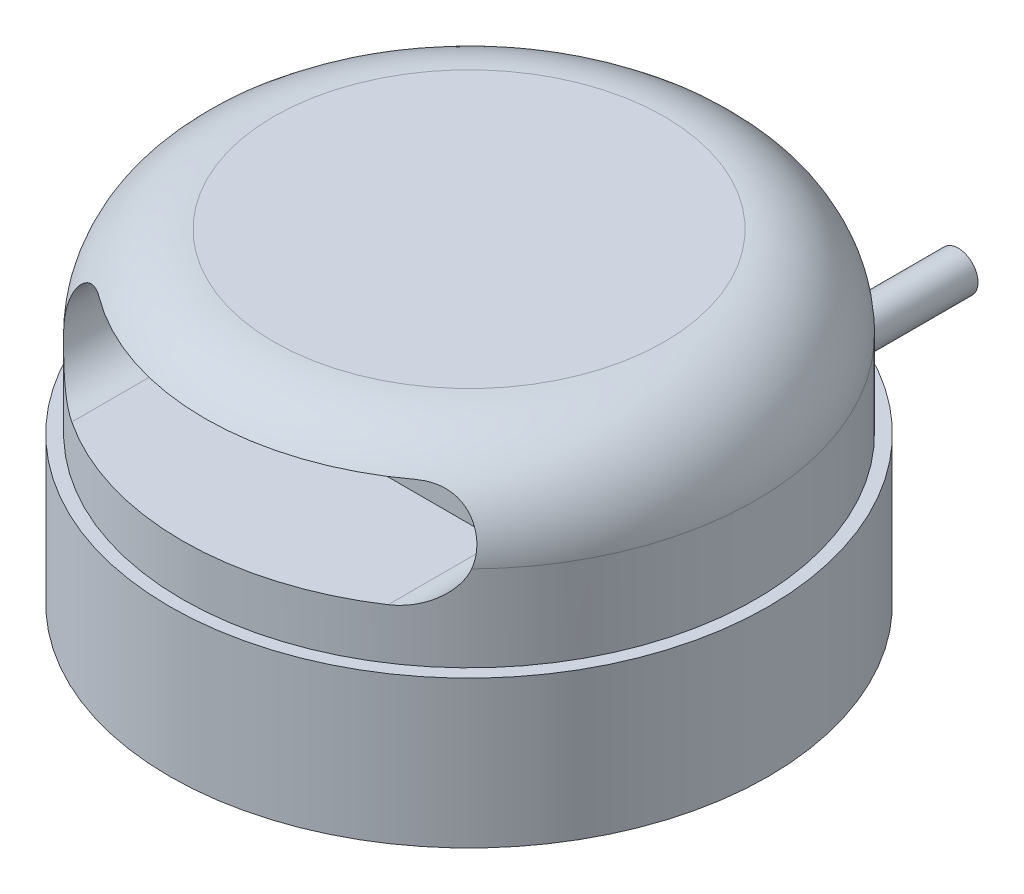
ISO-10303-21;
HEADER;
FILE_DESCRIPTION(('STEP AP214'),'2;1');
FILE_NAME('part.step','',(''),(''),'','','');
FILE_SCHEMA(('AUTOMOTIVE_DESIGN { 1 0 10303 214 1 1 1 1 }'));
ENDSEC;
DATA;
#1=APPLICATION_CONTEXT('core data for automotive mechanical design processes');
#2=APPLICATION_PROTOCOL_DEFINITION('international standard','automotive_design',2000,#1);
#3=PRODUCT_CONTEXT('',#1,'mechanical');
#4=PRODUCT('Part','Part','',(#3));
#5=PRODUCT_RELATED_PRODUCT_CATEGORY('part','',(#4));
#6=PRODUCT_DEFINITION_FORMATION('','',#4);
#7=PRODUCT_DEFINITION_CONTEXT('part definition',#1,'design');
#8=PRODUCT_DEFINITION('design','',#6,#7);
#9=PRODUCT_DEFINITION_SHAPE('','',#8);
#10=(LENGTH_UNIT() NAMED_UNIT(*) SI_UNIT(.MILLI.,.METRE.));
#11=(NAMED_UNIT(*) PLANE_ANGLE_UNIT() SI_UNIT($,.RADIAN.));
#12=(NAMED_UNIT(*) SI_UNIT($,.STERADIAN.) SOLID_ANGLE_UNIT());
#13=UNCERTAINTY_MEASURE_WITH_UNIT(LENGTH_MEASURE(1.E-05),#10,'distance_accuracy_value','');
#14=(GEOMETRIC_REPRESENTATION_CONTEXT(3) GLOBAL_UNCERTAINTY_ASSIGNED_CONTEXT((#13)) GLOBAL_UNIT_ASSIGNED_CONTEXT((#10,
#11,#12)) REPRESENTATION_CONTEXT('',''));
#15=CARTESIAN_POINT('',(0.,0.,0.));
#16=DIRECTION('',(0.,0.,1.));
#17=DIRECTION('',(1.,0.,0.));
#18=AXIS2_PLACEMENT_3D('',#15,#16,#17);
#19=CARTESIAN_POINT('',(0.,18.6,0.));
#20=DIRECTION('',(0.,-1.,0.));
#21=DIRECTION('',(0.,0.,-1.));
#22=AXIS2_PLACEMENT_3D('',#19,#20,#21);
#23=CYLINDRICAL_SURFACE('',#22,37.85);
#24=CARTESIAN_POINT('',(0.,9.5,0.));
#25=DIRECTION('',(0.,-1.,0.));
#26=DIRECTION('',(0.,0.,-1.));
#27=AXIS2_PLACEMENT_3D('',#24,#25,#26);
#28=CIRCLE('',#27,37.85);
#29=CARTESIAN_POINT('',(1.5,9.5,-37.8202657314832));
#30=VERTEX_POINT('',#29);
#31=CARTESIAN_POINT('',(-1.5,9.5,-37.8202657314832));
#32=VERTEX_POINT('',#31);
#33=EDGE_CURVE('E123',#30,#32,#28,.F.);
#34=ORIENTED_EDGE('',*,*,#33,.T.);
#35=CARTESIAN_POINT('',(-1.5,9.5,-37.8202657314832));
#36=CARTESIAN_POINT('',(-1.61253668712296,9.50001105184399,-37.8158072600323));
#37=CARTESIAN_POINT('',(-1.72504665527195,9.49525089813898,-37.8108371188779));
#38=CARTESIAN_POINT('',(-1.94921183622977,9.47628443016993,-37.7999413756868));
#39=CARTESIAN_POINT('',(-2.06086712013102,9.46207891039861,-37.7940158540432));
#40=CARTESIAN_POINT('',(-2.28243367643271,9.42433618036682,-37.7812826127025));
#41=CARTESIAN_POINT('',(-2.39234653027072,9.40080800337446,-37.7744757512726));
#42=CARTESIAN_POINT('',(-2.60972904452675,9.34462248128555,-37.7600808433361));
#43=CARTESIAN_POINT('',(-2.71719871197811,9.31196516247318,-37.7524927990785));
#44=CARTESIAN_POINT('',(-3.03487494604378,9.20059514186978,-37.7287281353576));
#45=CARTESIAN_POINT('',(-3.24048215674725,9.10846149616332,-37.7115431539878));
#46=CARTESIAN_POINT('',(-3.63313529085081,8.89118762776028,-37.6757461154074));
#47=CARTESIAN_POINT('',(-3.82018270805348,8.76605006438571,-37.6571341732612));
#48=CARTESIAN_POINT('',(-4.1715431118037,8.48556365663615,-37.6198365365566));
#49=CARTESIAN_POINT('',(-4.33574616134677,8.33007682497635,-37.6011509022075));
#50=CARTESIAN_POINT('',(-4.63574689453859,7.99357518161206,-37.5653463713142));
#51=CARTESIAN_POINT('',(-4.77154080247248,7.81255698200863,-37.5482276831946));
#52=CARTESIAN_POINT('',(-5.01082197457301,7.43003127987546,-37.5170464354348));
#53=CARTESIAN_POINT('',(-5.11430718674005,7.22852247701746,-37.5029840699259));
#54=CARTESIAN_POINT('',(-5.28588852054455,6.81073787635938,-37.4791866731115));
#55=CARTESIAN_POINT('',(-5.35398867830439,6.59446376591857,-37.4694511482921));
#56=CARTESIAN_POINT('',(-5.45233093677881,6.15521553429311,-37.4552674440067));
#57=CARTESIAN_POINT('',(-5.48288615280145,5.93231292895144,-37.4507755499511));
#58=CARTESIAN_POINT('',(-5.50624836080323,5.48449604860082,-37.4473480764364));
#59=CARTESIAN_POINT('',(-5.49905634996064,5.25958182688996,-37.4484123501985));
#60=CARTESIAN_POINT('',(-5.44732982033783,4.8157835419917,-37.4559709002314));
#61=CARTESIAN_POINT('',(-5.40305593074246,4.59686837494064,-37.4624272773163));
#62=CARTESIAN_POINT('',(-5.27883197336075,4.16961461620023,-37.4801325326619));
#63=CARTESIAN_POINT('',(-5.19888136506025,3.9612761848052,-37.4913814835316));
#64=CARTESIAN_POINT('',(-5.00530542424873,3.56026246940452,-37.5177151099787));
#65=CARTESIAN_POINT('',(-4.89156481519368,3.3676437290046,-37.5328128906292));
#66=CARTESIAN_POINT('',(-4.6337479161764,3.00414994913723,-37.565512106906));
#67=CARTESIAN_POINT('',(-4.48967128216891,2.83327515630633,-37.5831135709262));
#68=CARTESIAN_POINT('',(-4.17375936046013,2.51645421965203,-37.619512521416));
#69=CARTESIAN_POINT('',(-4.00167991617439,2.37075296909975,-37.6383195552361));
#70=CARTESIAN_POINT('',(-3.63531007884672,2.11017319004632,-37.6754665912568));
#71=CARTESIAN_POINT('',(-3.44101232933224,1.99530491271445,-37.6938064362994));
#72=CARTESIAN_POINT('',(-3.13683554275677,1.84848133332179,-37.7199320966155));
#73=CARTESIAN_POINT('',(-3.0330199695629,1.80369933992932,-37.7284313027375));
#74=CARTESIAN_POINT('',(-2.82194030576844,1.7230683043069,-37.7448052794968));
#75=CARTESIAN_POINT('',(-2.7146775361779,1.68721588516698,-37.7526802854182));
#76=CARTESIAN_POINT('',(-2.49758205344854,1.62474746649678,-37.7676636625462));
#77=CARTESIAN_POINT('',(-2.38775229982334,1.59812134118843,-37.7747728682667));
#78=CARTESIAN_POINT('',(-2.16622513815565,1.5542577371177,-37.7881233805168));
#79=CARTESIAN_POINT('',(-2.05452867352173,1.53701565536417,-37.7943651114329));
#80=CARTESIAN_POINT('',(-1.86883704656302,1.51635523480229,-37.8039067195663));
#81=CARTESIAN_POINT('',(-1.79514709109818,1.5102190922482,-37.8074780076315));
#82=CARTESIAN_POINT('',(-1.64764354230537,1.50204427809651,-37.8141934406102));
#83=CARTESIAN_POINT('',(-1.57383035562941,1.4999988398539,-37.8173382828814));
#84=CARTESIAN_POINT('',(-1.5,1.5,-37.8202657314832));
#85=B_SPLINE_CURVE_WITH_KNOTS('',3,(#35,#36,#37,#38,#39,#40,#41,#42,#43,#44,#45,#46,#47,#48,#49,
#50,#51,#52,#53,#54,#55,#56,#57,#58,#59,#60,#61,#62,#63,#64,#65,#66,#67,#68,#69,#70,#71,#72,#73,
#74,#75,#76,#77,#78,#79,#80,#81,#82,#83,#84),.UNSPECIFIED.,.F.,.F.,(4,2,2,2,2,2,2,2,2,2,2,2,2,2,
2,2,2,2,2,2,2,2,2,2,4),(0.,0.33776203725115,0.675495667393629,1.01290284479916,1.35030905076774,
2.02471981770825,2.69907625995383,3.3765733493742,4.05416042437273,4.73179052573439,
5.40934331765596,6.08120627582832,6.75305148531195,7.42021388864467,8.08738640005289,
8.75686167094439,9.42634453486127,10.1020125545614,10.7779049390013,11.1177155457961,
11.4573974501353,11.7967053669086,12.1358466985442,12.3578338425291,12.579453481404),.UNSPECIFIED.);
#86=CARTESIAN_POINT('',(-1.5,1.5,-37.8202657314832));
#87=VERTEX_POINT('',#86);
#88=EDGE_CURVE('E133',#32,#87,#85,.T.);
#89=ORIENTED_EDGE('',*,*,#88,.T.);
#90=CARTESIAN_POINT('',(0.,1.5,0.));
#91=DIRECTION('',(0.,1.,0.));
#92=DIRECTION('',(0.,0.,1.));
#93=AXIS2_PLACEMENT_3D('',#90,#91,#92);
#94=CIRCLE('',#93,37.85);
#95=CARTESIAN_POINT('',(1.5,1.5,-37.8202657314832));
#96=VERTEX_POINT('',#95);
#97=EDGE_CURVE('E139',#87,#96,#94,.F.);
#98=ORIENTED_EDGE('',*,*,#97,.T.);
#99=CARTESIAN_POINT('',(1.5,1.5,-37.8202657314832));
#100=CARTESIAN_POINT('',(1.61253668712296,1.49998894815601,-37.8158072600323));
#101=CARTESIAN_POINT('',(1.72504665527195,1.50474910186102,-37.8108371188779));
#102=CARTESIAN_POINT('',(1.94921183622977,1.52371556983007,-37.7999413756868));
#103=CARTESIAN_POINT('',(2.06086712013103,1.53792108960139,-37.7940158540432));
#104=CARTESIAN_POINT('',(2.28243367643271,1.57566381963319,-37.7812826127025));
#105=CARTESIAN_POINT('',(2.39234653027072,1.59919199662554,-37.7744757512726));
#106=CARTESIAN_POINT('',(2.60972904452675,1.65537751871445,-37.7600808433361));
#107=CARTESIAN_POINT('',(2.71719871197812,1.68803483752682,-37.7524927990785));
#108=CARTESIAN_POINT('',(3.03487494604378,1.79940485813022,-37.7287281353576));
#109=CARTESIAN_POINT('',(3.24048215674725,1.89153850383668,-37.7115431539878));
#110=CARTESIAN_POINT('',(3.63313529085081,2.10881237223972,-37.6757461154074));
#111=CARTESIAN_POINT('',(3.82018270805348,2.23394993561429,-37.6571341732612));
#112=CARTESIAN_POINT('',(4.1715431118037,2.51443634336386,-37.6198365365566));
#113=CARTESIAN_POINT('',(4.33574616134678,2.66992317502366,-37.6011509022075));
#114=CARTESIAN_POINT('',(4.63574689453859,3.00642481838794,-37.5653463713142));
#115=CARTESIAN_POINT('',(4.77154080247248,3.18744301799137,-37.5482276831946));
#116=CARTESIAN_POINT('',(5.01082197457301,3.56996872012454,-37.5170464354348));
#117=CARTESIAN_POINT('',(5.11430718674006,3.77147752298254,-37.5029840699259));
#118=CARTESIAN_POINT('',(5.28588852054455,4.18926212364062,-37.4791866731115));
#119=CARTESIAN_POINT('',(5.35398867830439,4.40553623408143,-37.4694511482921));
#120=CARTESIAN_POINT('',(5.45233093677881,4.84478446570689,-37.4552674440067));
#121=CARTESIAN_POINT('',(5.48288615280145,5.06768707104856,-37.4507755499511));
#122=CARTESIAN_POINT('',(5.50624836080323,5.51550395139918,-37.4473480764364));
#123=CARTESIAN_POINT('',(5.49905634996064,5.74041817311004,-37.4484123501985));
#124=CARTESIAN_POINT('',(5.44732982033783,6.1842164580083,-37.4559709002314));
#125=CARTESIAN_POINT('',(5.40305593074247,6.40313162505936,-37.4624272773163));
#126=CARTESIAN_POINT('',(5.27883197336075,6.83038538379977,-37.4801325326619));
#127=CARTESIAN_POINT('',(5.19888136506025,7.0387238151948,-37.4913814835316));
#128=CARTESIAN_POINT('',(5.00530542424874,7.43973753059548,-37.5177151099787));
#129=CARTESIAN_POINT('',(4.89156481519369,7.6323562709954,-37.5328128906292));
#130=CARTESIAN_POINT('',(4.63374791617641,7.99585005086276,-37.565512106906));
#131=CARTESIAN_POINT('',(4.48967128216891,8.16672484369367,-37.5831135709262));
#132=CARTESIAN_POINT('',(4.17375936046013,8.48354578034797,-37.619512521416));
#133=CARTESIAN_POINT('',(4.00167991617439,8.62924703090025,-37.6383195552361));
#134=CARTESIAN_POINT('',(3.63531007884672,8.88982680995368,-37.6754665912568));
#135=CARTESIAN_POINT('',(3.44101232933225,9.00469508728554,-37.6938064362994));
#136=CARTESIAN_POINT('',(3.13683554275678,9.15151866667821,-37.7199320966155));
#137=CARTESIAN_POINT('',(3.0330199695629,9.19630066007068,-37.7284313027375));
#138=CARTESIAN_POINT('',(2.82194030576844,9.27693169569311,-37.7448052794968));
#139=CARTESIAN_POINT('',(2.7146775361779,9.31278411483301,-37.7526802854182));
#140=CARTESIAN_POINT('',(2.49758205344854,9.37525253350322,-37.7676636625462));
#141=CARTESIAN_POINT('',(2.38775229982334,9.40187865881157,-37.7747728682667));
#142=CARTESIAN_POINT('',(2.16622513815566,9.44574226288231,-37.7881233805168));
#143=CARTESIAN_POINT('',(2.05452867352173,9.46298434463583,-37.7943651114329));
#144=CARTESIAN_POINT('',(1.86883704656302,9.48364476519771,-37.8039067195663));
#145=CARTESIAN_POINT('',(1.79514709109818,9.4897809077518,-37.8074780076315));
#146=CARTESIAN_POINT('',(1.64764354230537,9.49795572190349,-37.8141934406102));
#147=CARTESIAN_POINT('',(1.57383035562941,9.5000011601461,-37.8173382828814));
#148=CARTESIAN_POINT('',(1.5,9.5,-37.8202657314832));
#149=B_SPLINE_CURVE_WITH_KNOTS('',3,(#99,#100,#101,#102,#103,#104,#105,#106,#107,#108,#109,#110,
#111,#112,#113,#114,#115,#116,#117,#118,#119,#120,#121,#122,#123,#124,#125,#126,#127,#128,#129,
#130,#131,#132,#133,#134,#135,#136,#137,#138,#139,#140,#141,#142,#143,#144,#145,#146,#147,#148),
.UNSPECIFIED.,.F.,.F.,(4,2,2,2,2,2,2,2,2,2,2,2,2,2,2,2,2,2,2,2,2,2,2,2,4),(0.,0.33776203725115,
0.67549566739363,1.01290284479916,1.35030905076774,2.02471981770825,2.69907625995383,
3.37657334937419,4.05416042437273,4.73179052573439,5.40934331765596,6.08120627582831,
6.75305148531195,7.42021388864467,8.08738640005288,8.75686167094439,9.42634453486127,
10.1020125545614,10.7779049390013,11.1177155457961,11.4573974501353,11.7967053669086,
12.1358466985442,12.3578338425291,12.579453481404),.UNSPECIFIED.);
#150=EDGE_CURVE('E51',#96,#30,#149,.T.);
#151=ORIENTED_EDGE('',*,*,#150,.T.);
#152=EDGE_LOOP('',(#34,#89,#98,#151));
#153=FACE_BOUND('',#152,.T.);
#154=CARTESIAN_POINT('',(0.,18.6,0.));
#155=DIRECTION('',(0.,1.,0.));
#156=DIRECTION('',(0.,0.,1.));
#157=AXIS2_PLACEMENT_3D('',#154,#155,#156);
#158=CIRCLE('',#157,37.85);
#159=CARTESIAN_POINT('',(0.,18.6,37.85));
#160=VERTEX_POINT('',#159);
#161=EDGE_CURVE('E513',#160,#160,#158,.T.);
#162=ORIENTED_EDGE('',*,*,#161,.F.);
#163=EDGE_LOOP('',(#162));
#164=FACE_BOUND('',#163,.T.);
#165=CARTESIAN_POINT('',(0.,0.,0.));
#166=DIRECTION('',(0.,1.,0.));
#167=DIRECTION('',(0.,0.,1.));
#168=AXIS2_PLACEMENT_3D('',#165,#166,#167);
#169=CIRCLE('',#168,37.85);
#170=CARTESIAN_POINT('',(0.,0.,37.85));
#171=VERTEX_POINT('',#170);
#172=EDGE_CURVE('E522',#171,#171,#169,.T.);
#173=ORIENTED_EDGE('',*,*,#172,.T.);
#174=EDGE_LOOP('',(#173));
#175=FACE_BOUND('',#174,.T.);
#176=ADVANCED_FACE('F36',(#153,#164,#175),#23,.T.);
#177=CARTESIAN_POINT('',(0.,18.6,0.));
#178=DIRECTION('',(0.,1.,0.));
#179=DIRECTION('',(0.,0.,1.));
#180=AXIS2_PLACEMENT_3D('',#177,#178,#179);
#181=PLANE('',#180);
#182=CARTESIAN_POINT('',(0.,18.6,0.));
#183=DIRECTION('',(0.,-1.,0.));
#184=DIRECTION('',(0.,0.,-1.));
#185=AXIS2_PLACEMENT_3D('',#182,#183,#184);
#186=CIRCLE('',#185,36.25);
#187=CARTESIAN_POINT('',(0.,18.6,-36.25));
#188=VERTEX_POINT('',#187);
#189=EDGE_CURVE('E530',#188,#188,#186,.T.);
#190=ORIENTED_EDGE('',*,*,#189,.T.);
#191=EDGE_LOOP('',(#190));
#192=FACE_BOUND('',#191,.T.);
#193=ORIENTED_EDGE('',*,*,#161,.T.);
#194=EDGE_LOOP('',(#193));
#195=FACE_BOUND('',#194,.T.);
#196=ADVANCED_FACE('F267',(#192,#195),#181,.T.);
#197=CARTESIAN_POINT('',(0.,0.,0.));
#198=DIRECTION('',(0.,1.,0.));
#199=DIRECTION('',(0.,0.,1.));
#200=AXIS2_PLACEMENT_3D('',#197,#198,#199);
#201=PLANE('',#200);
#202=CARTESIAN_POINT('',(-20.8596500450031,0.,20.8596500450031));
#203=DIRECTION('',(0.,-1.,0.));
#204=DIRECTION('',(0.,0.,-1.));
#205=AXIS2_PLACEMENT_3D('',#202,#203,#204);
#206=CIRCLE('',#205,1.69999999999999);
#207=CARTESIAN_POINT('',(-20.8596500450031,0.,19.1596500450032));
#208=VERTEX_POINT('',#207);
#209=EDGE_CURVE('E129',#208,#208,#206,.T.);
#210=ORIENTED_EDGE('',*,*,#209,.F.);
#211=EDGE_LOOP('',(#210));
#212=FACE_BOUND('',#211,.T.);
#213=CARTESIAN_POINT('',(20.8596500450031,0.,20.8596500450031));
#214=DIRECTION('',(0.,-1.,0.));
#215=DIRECTION('',(0.,0.,-1.));
#216=AXIS2_PLACEMENT_3D('',#213,#214,#215);
#217=CIRCLE('',#216,1.69999999999999);
#218=CARTESIAN_POINT('',(20.8596500450031,0.,19.1596500450032));
#219=VERTEX_POINT('',#218);
#220=EDGE_CURVE('E466',#219,#219,#217,.T.);
#221=ORIENTED_EDGE('',*,*,#220,.F.);
#222=EDGE_LOOP('',(#221));
#223=FACE_BOUND('',#222,.T.);
#224=CARTESIAN_POINT('',(20.8596500450031,0.,-20.8596500450031));
#225=DIRECTION('',(0.,-1.,0.));
#226=DIRECTION('',(0.,0.,-1.));
#227=AXIS2_PLACEMENT_3D('',#224,#225,#226);
#228=CIRCLE('',#227,1.69999999999999);
#229=CARTESIAN_POINT('',(20.8596500450031,0.,-22.5596500450031));
#230=VERTEX_POINT('',#229);
#231=EDGE_CURVE('E472',#230,#230,#228,.T.);
#232=ORIENTED_EDGE('',*,*,#231,.F.);
#233=EDGE_LOOP('',(#232));
#234=FACE_BOUND('',#233,.T.);
#235=CARTESIAN_POINT('',(-20.8596500450031,0.,-20.8596500450031));
#236=DIRECTION('',(0.,-1.,0.));
#237=DIRECTION('',(0.,0.,-1.));
#238=AXIS2_PLACEMENT_3D('',#235,#236,#237);
#239=CIRCLE('',#238,1.69999999999999);
#240=CARTESIAN_POINT('',(-20.8596500450031,0.,-22.5596500450031));
#241=VERTEX_POINT('',#240);
#242=EDGE_CURVE('E478',#241,#241,#239,.T.);
#243=ORIENTED_EDGE('',*,*,#242,.F.);
#244=EDGE_LOOP('',(#243));
#245=FACE_BOUND('',#244,.T.);
#246=ORIENTED_EDGE('',*,*,#172,.F.);
#247=EDGE_LOOP('',(#246));
#248=FACE_BOUND('',#247,.T.);
#249=ADVANCED_FACE('F265',(#212,#223,#234,#245,#248),#201,.F.);
#250=CARTESIAN_POINT('',(0.,41.,0.));
#251=DIRECTION('',(0.,-1.,0.));
#252=DIRECTION('',(0.,0.,-1.));
#253=AXIS2_PLACEMENT_3D('',#250,#251,#252);
#254=PLANE('',#253);
#255=CARTESIAN_POINT('',(0.,41.,0.));
#256=DIRECTION('',(0.,-1.,0.));
#257=DIRECTION('',(0.,0.,-1.));
#258=AXIS2_PLACEMENT_3D('',#255,#256,#257);
#259=CIRCLE('',#258,24.6823382141137);
#260=CARTESIAN_POINT('',(0.,41.,-24.6823382141137));
#261=VERTEX_POINT('',#260);
#262=EDGE_CURVE('E525',#261,#261,#259,.T.);
#263=ORIENTED_EDGE('',*,*,#262,.F.);
#264=EDGE_LOOP('',(#263));
#265=FACE_BOUND('',#264,.T.);
#266=ADVANCED_FACE('F259',(#265),#254,.F.);
#267=CARTESIAN_POINT('',(0.,29.4323382141137,0.));
#268=DIRECTION('',(0.,-1.,0.));
#269=DIRECTION('',(0.,0.,-1.));
#270=AXIS2_PLACEMENT_3D('',#267,#268,#269);
#271=TOROIDAL_SURFACE('',#270,24.6823382141137,11.5676617858863);
#272=CARTESIAN_POINT('',(0.,29.4323382141137,0.));
#273=DIRECTION('',(0.,-1.,0.));
#274=DIRECTION('',(0.,0.,-1.));
#275=AXIS2_PLACEMENT_3D('',#272,#273,#274);
#276=CIRCLE('',#275,36.25);
#277=CARTESIAN_POINT('',(-25.7915832485661,29.4323382141137,25.4726664001294));
#278=VERTEX_POINT('',#277);
#279=CARTESIAN_POINT('',(25.7915832485661,29.4323382141137,25.4726664001294));
#280=VERTEX_POINT('',#279);
#281=EDGE_CURVE('E510',#278,#280,#276,.T.);
#282=ORIENTED_EDGE('',*,*,#281,.F.);
#283=CARTESIAN_POINT('',(-25.7915291089968,29.4321382141137,25.4727212149472));
#284=CARTESIAN_POINT('',(-25.834369599522,29.5903106740177,25.4293771303518));
#285=CARTESIAN_POINT('',(-25.8708047372308,29.750664240021,25.387626775763));
#286=CARTESIAN_POINT('',(-25.9304940586516,30.0746296389626,25.3073712621504));
#287=CARTESIAN_POINT('',(-25.9537462110058,30.2382419700234,25.2688666040317));
#288=CARTESIAN_POINT('',(-25.9867087429567,30.5678000780522,25.1951224701447));
#289=CARTESIAN_POINT('',(-25.9964002820002,30.7337487786058,25.159887600575));
#290=CARTESIAN_POINT('',(-26.0019382217081,31.066568595162,25.0928901572033));
#291=CARTESIAN_POINT('',(-25.9977854739844,31.2334396537966,25.0611273699452));
#292=CARTESIAN_POINT('',(-25.9754776098843,31.5671671107134,25.0012417281311));
#293=CARTESIAN_POINT('',(-25.9573012151964,31.7340231010123,24.9731244808076));
#294=CARTESIAN_POINT('',(-25.9068917587686,32.0662338463615,24.9208887890671));
#295=CARTESIAN_POINT('',(-25.8746589213471,32.2315886253257,24.8967702808452));
#296=CARTESIAN_POINT('',(-25.7962519500024,32.5594397651069,24.8529389030441));
#297=CARTESIAN_POINT('',(-25.7500872681503,32.7219379851052,24.8332230622019));
#298=CARTESIAN_POINT('',(-25.644025994902,33.0429236257679,24.7986638117663));
#299=CARTESIAN_POINT('',(-25.5841300113686,33.2014112236315,24.7838201865584));
#300=CARTESIAN_POINT('',(-25.4532665497505,33.5077194082037,24.7600053731427));
#301=CARTESIAN_POINT('',(-25.3827526873975,33.6557193605219,24.7508491393538));
#302=CARTESIAN_POINT('',(-25.2297322170818,33.9456344180614,24.7382223985196));
#303=CARTESIAN_POINT('',(-25.1472265192455,34.0875499840029,24.734751460231));
#304=CARTESIAN_POINT('',(-24.9708518609463,34.3641544336166,24.7341560975746));
#305=CARTESIAN_POINT('',(-24.8769831067072,34.4988434483767,24.7370315580447));
#306=CARTESIAN_POINT('',(-24.6787012354933,34.7598683349299,24.7498237440254));
#307=CARTESIAN_POINT('',(-24.5742888599882,34.8862047930756,24.7597399746961));
#308=CARTESIAN_POINT('',(-24.3631900631354,35.121390811717,24.7863804947781));
#309=CARTESIAN_POINT('',(-24.2571135273792,35.2308444245337,24.8026097446667));
#310=CARTESIAN_POINT('',(-24.0376669474697,35.4407538638338,24.8423004206009));
#311=CARTESIAN_POINT('',(-23.9242974508657,35.5412103644611,24.865761304202));
#312=CARTESIAN_POINT('',(-23.691563015799,35.7323363889596,24.9202778079311));
#313=CARTESIAN_POINT('',(-23.5722060978655,35.8230185189126,24.9513234728282));
#314=CARTESIAN_POINT('',(-23.3286239514553,35.9942389713798,25.0212707620515));
#315=CARTESIAN_POINT('',(-23.2043988979907,36.0747776581183,25.0601721041703));
#316=CARTESIAN_POINT('',(-22.9594364109958,36.2212021704031,25.1434922894571));
#317=CARTESIAN_POINT('',(-22.838890857461,36.2876546916277,25.1874824191737));
#318=CARTESIAN_POINT('',(-22.5956953494698,36.4111897676229,25.2824097031083));
#319=CARTESIAN_POINT('',(-22.4730446260833,36.4682688145973,25.3333494450543));
#320=CARTESIAN_POINT('',(-22.2264507865135,36.5732321236396,25.4420031173541));
#321=CARTESIAN_POINT('',(-22.1025054039623,36.6210956701409,25.4997318504873));
#322=CARTESIAN_POINT('',(-21.8545068028367,36.7077195546776,25.6214603739771));
#323=CARTESIAN_POINT('',(-21.7304535709768,36.7464785391725,25.6854610947644));
#324=CARTESIAN_POINT('',(-21.4688353682969,36.8191934144669,25.8268880044347));
#325=CARTESIAN_POINT('',(-21.3313532446537,36.85208793495,25.9050120457454));
#326=CARTESIAN_POINT('',(-21.058046987586,36.9076215231359,26.0676255750817));
#327=CARTESIAN_POINT('',(-20.9222235250306,36.9302565667483,26.1521175456821));
#328=CARTESIAN_POINT('',(-20.6536619974084,36.9658177970346,26.3261063038909));
#329=CARTESIAN_POINT('',(-20.5209108103335,36.9787982708633,26.4155720195455));
#330=CARTESIAN_POINT('',(-20.2582077625725,36.9958822830094,26.5990416357387));
#331=CARTESIAN_POINT('',(-20.12825295807,36.9999956591803,26.6930403884213));
#332=CARTESIAN_POINT('',(-19.9998,36.9999999966667,26.788956882745));
#333=B_SPLINE_CURVE_WITH_KNOTS('',3,(#283,#284,#285,#286,#287,#288,#289,#290,#291,#292,#293,
#294,#295,#296,#297,#298,#299,#300,#301,#302,#303,#304,#305,#306,#307,#308,#309,#310,#311,#312,
#313,#314,#315,#316,#317,#318,#319,#320,#321,#322,#323,#324,#325,#326,#327,#328,#329,#330,#331,
#332),.UNSPECIFIED.,.F.,.F.,(4,2,2,2,2,2,2,2,2,2,2,2,2,2,2,2,2,2,2,2,2,2,2,2,4),(0.,
0.508392767732529,1.01686385211273,1.52604068600459,2.0351861991708,2.54510577021678,
3.05501720405968,3.56458346285607,4.07412716831793,4.56607962019392,5.05799475456218,
5.54990096268321,6.04177260204706,6.50102851628354,6.9602499901342,7.41887193131846,
7.87747739989973,8.3105060762716,8.74369643568819,9.17784947883735,9.61206702508224,
10.0961064054761,10.580335477436,11.0618207314103,11.5427715123487),.UNSPECIFIED.);
#334=CARTESIAN_POINT('',(-20.,37.,26.7888075642195));
#335=VERTEX_POINT('',#334);
#336=EDGE_CURVE('E247',#278,#335,#333,.T.);
#337=ORIENTED_EDGE('',*,*,#336,.T.);
#338=CARTESIAN_POINT('',(0.,37.,0.));
#339=DIRECTION('',(0.,1.,0.));
#340=DIRECTION('',(0.,0.,1.));
#341=AXIS2_PLACEMENT_3D('',#338,#339,#340);
#342=CIRCLE('',#341,33.431126375173);
#343=CARTESIAN_POINT('',(20.,37.,26.7888075642026));
#344=VERTEX_POINT('',#343);
#345=EDGE_CURVE('E39',#335,#344,#342,.T.);
#346=ORIENTED_EDGE('',*,*,#345,.T.);
#347=CARTESIAN_POINT('',(19.9998,36.9999999966667,26.788956882745));
#348=CARTESIAN_POINT('',(20.1422745771607,36.9999927319548,26.682563430961));
#349=CARTESIAN_POINT('',(20.2866157949047,36.9949327316935,26.5785254636698));
#350=CARTESIAN_POINT('',(20.5787438959839,36.9738246308488,26.3760900933883));
#351=CARTESIAN_POINT('',(20.7265359231809,36.9577589611176,26.2777019822592));
#352=CARTESIAN_POINT('',(21.0256970806642,36.9136217532393,26.0872843462736));
#353=CARTESIAN_POINT('',(21.1770821515148,36.8854800666127,25.9952956812242));
#354=CARTESIAN_POINT('',(21.4815712611897,36.8162959550229,25.819516436352));
#355=CARTESIAN_POINT('',(21.6346741741503,36.7752615522998,25.7357208009749));
#356=CARTESIAN_POINT('',(21.9169122759622,36.6871504801021,25.5899707378738));
#357=CARTESIAN_POINT('',(22.0459765710467,36.6420805308274,25.5266641776465));
#358=CARTESIAN_POINT('',(22.3034748647654,36.541938076642,25.4070893686154));
#359=CARTESIAN_POINT('',(22.4319089744082,36.4868674034779,25.3508198340819));
#360=CARTESIAN_POINT('',(22.6866678138935,36.366711354006,25.2458550239663));
#361=CARTESIAN_POINT('',(22.8129976057756,36.3016556729363,25.1971381234166));
#362=CARTESIAN_POINT('',(23.062711836971,36.1614241100409,25.1072939944817));
#363=CARTESIAN_POINT('',(23.1860963151375,36.0862483618016,25.06616666593));
#364=CARTESIAN_POINT('',(23.4290834163931,35.9257143508709,24.9913937083642));
#365=CARTESIAN_POINT('',(23.5486715840662,35.840321979671,24.9577742791889));
#366=CARTESIAN_POINT('',(23.7823865587287,35.6599720424649,24.8980312746397));
#367=CARTESIAN_POINT('',(23.8965132501405,35.5650142741642,24.8719078578407));
#368=CARTESIAN_POINT('',(24.1182856421468,35.3659990361066,24.8268070548625));
#369=CARTESIAN_POINT('',(24.2259237051167,35.2619311830912,24.807837957019));
#370=CARTESIAN_POINT('',(24.4335567592604,35.0454991107523,24.776646188798));
#371=CARTESIAN_POINT('',(24.533551864203,34.9331350149709,24.7644234179816));
#372=CARTESIAN_POINT('',(24.7213107008394,34.705421965325,24.7465652478));
#373=CARTESIAN_POINT('',(24.8093986006595,34.5903583153143,24.7406924982318));
#374=CARTESIAN_POINT('',(24.9771034326484,34.3540191193281,24.7342252407859));
#375=CARTESIAN_POINT('',(25.0567174280673,34.2327414412261,24.7336325569415));
#376=CARTESIAN_POINT('',(25.2068716175582,33.9848738499901,24.7372548160767));
#377=CARTESIAN_POINT('',(25.2774175590746,33.8582873698009,24.7414666969789));
#378=CARTESIAN_POINT('',(25.4091104458246,33.6004779855293,24.75424719557));
#379=CARTESIAN_POINT('',(25.4702539980606,33.4692534286359,24.7628173812378));
#380=CARTESIAN_POINT('',(25.5859376733979,33.1955820861366,24.7844937154647));
#381=CARTESIAN_POINT('',(25.639920197353,33.052917368281,24.7978259525028));
#382=CARTESIAN_POINT('',(25.7367675192731,32.764277491654,24.8284659234946));
#383=CARTESIAN_POINT('',(25.7796316484824,32.6183021343264,24.8457738964651));
#384=CARTESIAN_POINT('',(25.8541028473272,32.3238436300103,24.8840186175486));
#385=CARTESIAN_POINT('',(25.8857003119363,32.1753584557597,24.9049584393807));
#386=CARTESIAN_POINT('',(25.9374967685405,31.8769599398544,24.9501493687335));
#387=CARTESIAN_POINT('',(25.9576988514383,31.7270469966997,24.9743995761209));
#388=CARTESIAN_POINT('',(25.9876625289241,31.4168230069332,25.0276636335607));
#389=CARTESIAN_POINT('',(25.996655034496,31.2564730369825,25.0568852884383));
#390=CARTESIAN_POINT('',(26.0017972871695,30.9362492683635,25.1185917788698));
#391=CARTESIAN_POINT('',(25.9979508153403,30.77637534338,25.1510756509704));
#392=CARTESIAN_POINT('',(25.9776218716659,30.4583411415745,25.219111515728));
#393=CARTESIAN_POINT('',(25.9611574917541,30.3001787397128,25.2546590509003));
#394=CARTESIAN_POINT('',(25.9158889842115,29.9864132450506,25.3287576196365));
#395=CARTESIAN_POINT('',(25.8870917706421,29.8308087688991,25.3673069604286));
#396=CARTESIAN_POINT('',(25.8430315402388,29.6359032567366,25.4180223995333));
#397=CARTESIAN_POINT('',(25.8333161961556,29.5949400507988,25.4288196760845));
#398=CARTESIAN_POINT('',(25.8130492505263,29.5133179333028,25.450616267159));
#399=CARTESIAN_POINT('',(25.8024984293419,29.47265877572,25.4616153859457));
#400=CARTESIAN_POINT('',(25.7915291089968,29.4321382141137,25.4727212149472));
#401=B_SPLINE_CURVE_WITH_KNOTS('',3,(#347,#348,#349,#350,#351,#352,#353,#354,#355,#356,#357,
#358,#359,#360,#361,#362,#363,#364,#365,#366,#367,#368,#369,#370,#371,#372,#373,#374,#375,#376,
#377,#378,#379,#380,#381,#382,#383,#384,#385,#386,#387,#388,#389,#390,#391,#392,#393,#394,#395,
#396,#397,#398,#399,#400),.UNSPECIFIED.,.F.,.F.,(4,2,2,2,2,2,2,2,2,2,2,2,2,2,2,2,2,2,2,2,2,2,2,
2,2,2,4),(0.,0.533481379373762,1.0678163844365,1.60529822775659,2.14244629365092,
2.59394582808751,3.04536274848944,3.49546228482795,3.94555588036293,4.39719641289392,
4.84884649898021,5.30101822969511,5.75318322832323,6.18779132704097,6.62254955817129,
7.05703086100888,7.49166858705549,7.95051857897669,8.40939616367686,8.86866401936911,
9.32780724249,9.81697399423246,10.3059966994456,10.7943195381313,11.2823689697912,
11.412749424791,11.5430095051729),.UNSPECIFIED.);
#402=EDGE_CURVE('E238',#344,#280,#401,.T.);
#403=ORIENTED_EDGE('',*,*,#402,.T.);
#404=EDGE_LOOP('',(#282,#337,#346,#403));
#405=FACE_BOUND('',#404,.T.);
#406=ORIENTED_EDGE('',*,*,#262,.T.);
#407=EDGE_LOOP('',(#406));
#408=FACE_BOUND('',#407,.T.);
#409=ADVANCED_FACE('F255',(#405,#408),#271,.T.);
#410=CARTESIAN_POINT('',(0.,18.6,0.));
#411=DIRECTION('',(0.,-1.,0.));
#412=DIRECTION('',(0.,0.,-1.));
#413=AXIS2_PLACEMENT_3D('',#410,#411,#412);
#414=CYLINDRICAL_SURFACE('',#413,36.25);
#415=ORIENTED_EDGE('',*,*,#189,.F.);
#416=EDGE_LOOP('',(#415));
#417=FACE_BOUND('',#416,.T.);
#418=ORIENTED_EDGE('',*,*,#281,.T.);
#419=CARTESIAN_POINT('',(25.7915832485661,29.4323382141137,25.4726664001294));
#420=CARTESIAN_POINT('',(25.7054454015778,29.1141055733967,25.5599300716653));
#421=CARTESIAN_POINT('',(25.5952940771333,28.8109732721039,25.6705620862075));
#422=CARTESIAN_POINT('',(25.3369386832053,28.2406633532778,25.9255394196944));
#423=CARTESIAN_POINT('',(25.1891250532882,27.973157321474,26.0695375267625));
#424=CARTESIAN_POINT('',(24.9247475339906,27.5675789632346,26.3218423361509));
#425=CARTESIAN_POINT('',(24.8174041868173,27.418724270291,26.4231446695851));
#426=CARTESIAN_POINT('',(24.5923459555208,27.1343567526404,26.6327371050094));
#427=CARTESIAN_POINT('',(24.4746299642733,26.9988453554069,26.7410279525877));
#428=CARTESIAN_POINT('',(24.1066432949396,26.6110464870275,27.074740821396));
#429=CARTESIAN_POINT('',(23.8423161870439,26.3786648822588,27.3082472724906));
#430=CARTESIAN_POINT('',(23.4214910989402,26.0680085419422,27.6682407063865));
#431=CARTESIAN_POINT('',(23.27571369576,25.9700610548349,27.7910282781112));
#432=CARTESIAN_POINT('',(22.97722598035,25.7878324524192,28.0383150041197));
#433=CARTESIAN_POINT('',(22.824516272945,25.7035501477828,28.1628140084274));
#434=CARTESIAN_POINT('',(22.3577468317774,25.47174947758,28.5368517014035));
#435=CARTESIAN_POINT('',(22.034230224866,25.3446794865124,28.7876338632975));
#436=CARTESIAN_POINT('',(21.4283989537862,25.1655774924229,29.2404235518313));
#437=CARTESIAN_POINT('',(21.1492653714393,25.1041113571413,29.443021309738));
#438=CARTESIAN_POINT('',(20.7232522895197,25.0420196296512,29.7428910752287));
#439=CARTESIAN_POINT('',(20.5799358254711,25.0263399266522,29.842238312285));
#440=CARTESIAN_POINT('',(20.2913275956305,25.0053310317634,30.0392264861414));
#441=CARTESIAN_POINT('',(20.1460352803542,25.0000047809996,30.1368669302855));
#442=CARTESIAN_POINT('',(20.,25.,30.2334665561196));
#443=B_SPLINE_CURVE_WITH_KNOTS('',3,(#419,#420,#421,#422,#423,#424,#425,#426,#427,#428,#429,
#430,#431,#432,#433,#434,#435,#436,#437,#438,#439,#440,#441,#442),.UNSPECIFIED.,.F.,.F.,(4,2,2,
2,2,2,2,2,2,2,2,4),(0.,1.01833826711114,2.02652105632113,2.65470579818096,3.28295767075604,
4.54419770641249,5.18666431672222,5.82907498089905,7.11023312312215,8.15882964821825,
8.68379493425009,9.20890932644441),.UNSPECIFIED.);
#444=CARTESIAN_POINT('',(20.,25.,30.2334665561196));
#445=VERTEX_POINT('',#444);
#446=EDGE_CURVE('E230',#280,#445,#443,.T.);
#447=ORIENTED_EDGE('',*,*,#446,.T.);
#448=CARTESIAN_POINT('',(0.,25.,0.));
#449=DIRECTION('',(0.,-1.,0.));
#450=DIRECTION('',(0.,0.,-1.));
#451=AXIS2_PLACEMENT_3D('',#448,#449,#450);
#452=CIRCLE('',#451,36.25);
#453=CARTESIAN_POINT('',(-20.,25.,30.2334665561196));
#454=VERTEX_POINT('',#453);
#455=EDGE_CURVE('E508',#445,#454,#452,.T.);
#456=ORIENTED_EDGE('',*,*,#455,.T.);
#457=CARTESIAN_POINT('',(-20.,25.,30.2334665561196));
#458=CARTESIAN_POINT('',(-20.2125475955985,25.0000174144617,30.0928942849592));
#459=CARTESIAN_POINT('',(-20.4235239381676,25.0112922136744,29.9500769952143));
#460=CARTESIAN_POINT('',(-20.8408331262036,25.0555019627663,29.6611873466258));
#461=CARTESIAN_POINT('',(-21.0471675577168,25.0884293944625,29.5151161346043));
#462=CARTESIAN_POINT('',(-21.4544974775543,25.1752307809169,29.2203796993305));
#463=CARTESIAN_POINT('',(-21.6554735926429,25.2291719741479,29.0717076273614));
#464=CARTESIAN_POINT('',(-22.0501917293148,25.3573252974629,28.7734721092491));
#465=CARTESIAN_POINT('',(-22.2439332281404,25.4315388891766,28.6239085995944));
#466=CARTESIAN_POINT('',(-22.618556652582,25.5977630566547,28.3287650266864));
#467=CARTESIAN_POINT('',(-22.7996338001472,25.6893143296696,28.1831739616539));
#468=CARTESIAN_POINT('',(-23.1527204007679,25.8910177549047,27.8938368662621));
#469=CARTESIAN_POINT('',(-23.3247291065281,26.001171436943,27.7500909886937));
#470=CARTESIAN_POINT('',(-23.6583941669554,26.2399357281785,27.4661758854503));
#471=CARTESIAN_POINT('',(-23.8200571228812,26.3685343949967,27.3260044141255));
#472=CARTESIAN_POINT('',(-24.1316957122697,26.6442732256893,27.0511911738499));
#473=CARTESIAN_POINT('',(-24.2816763205846,26.7914054265435,26.9165470627899));
#474=CARTESIAN_POINT('',(-24.6202463880278,27.1611294200378,26.6078096114055));
#475=CARTESIAN_POINT('',(-24.8032105402421,27.3917799857565,26.4370365457869));
#476=CARTESIAN_POINT('',(-25.1382793532688,27.8875963955053,26.1186252662189));
#477=CARTESIAN_POINT('',(-25.2905108125792,28.1526126892915,25.9708925903832));
#478=CARTESIAN_POINT('',(-25.4976931479335,28.5905905343352,25.7670533115943));
#479=CARTESIAN_POINT('',(-25.5657881702135,28.7520362986291,25.6994279513236));
#480=CARTESIAN_POINT('',(-25.6889646094626,29.0849671047047,25.576300392277));
#481=CARTESIAN_POINT('',(-25.7439971739234,29.2564869310367,25.5208437601524));
#482=CARTESIAN_POINT('',(-25.7915832485661,29.4323382141137,25.4726664001294));
#483=B_SPLINE_CURVE_WITH_KNOTS('',3,(#457,#458,#459,#460,#461,#462,#463,#464,#465,#466,#467,
#468,#469,#470,#471,#472,#473,#474,#475,#476,#477,#478,#479,#480,#481,#482),.UNSPECIFIED.,.F.,
.F.,(4,2,2,2,2,2,2,2,2,2,2,2,4),(0.,0.764117016948121,1.52796885873038,2.29428516903573,
3.06065674495407,3.80901537836442,4.55743558501815,5.30537338922589,6.05299092759564,
7.07068584340459,8.08409199701679,8.64653032773619,9.211040107421),.UNSPECIFIED.);
#484=EDGE_CURVE('E511',#454,#278,#483,.T.);
#485=ORIENTED_EDGE('',*,*,#484,.T.);
#486=EDGE_LOOP('',(#418,#447,#456,#485));
#487=FACE_BOUND('',#486,.T.);
#488=ADVANCED_FACE('F221',(#417,#487),#414,.T.);
#489=CARTESIAN_POINT('',(-20.,37.,16.25));
#490=DIRECTION('',(0.,1.,0.));
#491=DIRECTION('',(0.,0.,1.));
#492=AXIS2_PLACEMENT_3D('',#489,#490,#491);
#493=PLANE('',#492);
#494=DIRECTION('',(0.,0.,1.));
#495=VECTOR('',#494,1.);
#496=CARTESIAN_POINT('',(-20.,37.,16.25));
#497=LINE('',#496,#495);
#498=CARTESIAN_POINT('',(-20.,37.,16.25));
#499=VERTEX_POINT('',#498);
#500=EDGE_CURVE('E248',#499,#335,#497,.T.);
#501=ORIENTED_EDGE('',*,*,#500,.F.);
#502=DIRECTION('',(-1.,0.,0.));
#503=VECTOR('',#502,1.);
#504=CARTESIAN_POINT('',(-20.,37.,16.25));
#505=LINE('',#504,#503);
#506=CARTESIAN_POINT('',(20.,37.,16.25));
#507=VERTEX_POINT('',#506);
#508=EDGE_CURVE('E493',#507,#499,#505,.T.);
#509=ORIENTED_EDGE('',*,*,#508,.F.);
#510=DIRECTION('',(0.,0.,1.));
#511=VECTOR('',#510,1.);
#512=CARTESIAN_POINT('',(20.,37.,16.25));
#513=LINE('',#512,#511);
#514=EDGE_CURVE('E498',#507,#344,#513,.T.);
#515=ORIENTED_EDGE('',*,*,#514,.T.);
#516=ORIENTED_EDGE('',*,*,#345,.F.);
#517=EDGE_LOOP('',(#501,#509,#515,#516));
#518=FACE_BOUND('',#517,.T.);
#519=ADVANCED_FACE('F217',(#518),#493,.F.);
#520=CARTESIAN_POINT('',(-20.,31.,16.25));
#521=DIRECTION('',(0.,0.,1.));
#522=DIRECTION('',(1.,0.,0.));
#523=AXIS2_PLACEMENT_3D('',#520,#521,#522);
#524=CYLINDRICAL_SURFACE('',#523,6.);
#525=ORIENTED_EDGE('',*,*,#484,.F.);
#526=DIRECTION('',(0.,0.,1.));
#527=VECTOR('',#526,1.);
#528=CARTESIAN_POINT('',(-20.,25.,16.25));
#529=LINE('',#528,#527);
#530=CARTESIAN_POINT('',(-20.,25.,16.25));
#531=VERTEX_POINT('',#530);
#532=EDGE_CURVE('E59',#531,#454,#529,.T.);
#533=ORIENTED_EDGE('',*,*,#532,.F.);
#534=CARTESIAN_POINT('',(-20.,31.,16.25));
#535=DIRECTION('',(0.,0.,1.));
#536=DIRECTION('',(1.,0.,0.));
#537=AXIS2_PLACEMENT_3D('',#534,#535,#536);
#538=CIRCLE('',#537,6.);
#539=EDGE_CURVE('E484',#499,#531,#538,.T.);
#540=ORIENTED_EDGE('',*,*,#539,.F.);
#541=ORIENTED_EDGE('',*,*,#500,.T.);
#542=ORIENTED_EDGE('',*,*,#336,.F.);
#543=EDGE_LOOP('',(#525,#533,#540,#541,#542));
#544=FACE_BOUND('',#543,.T.);
#545=ADVANCED_FACE('F220',(#544),#524,.F.);
#546=CARTESIAN_POINT('',(20.,31.,16.25));
#547=DIRECTION('',(0.,0.,1.));
#548=DIRECTION('',(1.,0.,0.));
#549=AXIS2_PLACEMENT_3D('',#546,#547,#548);
#550=CYLINDRICAL_SURFACE('',#549,6.);
#551=ORIENTED_EDGE('',*,*,#514,.F.);
#552=CARTESIAN_POINT('',(20.,31.,16.25));
#553=DIRECTION('',(0.,0.,1.));
#554=DIRECTION('',(1.,0.,0.));
#555=AXIS2_PLACEMENT_3D('',#552,#553,#554);
#556=CIRCLE('',#555,6.);
#557=CARTESIAN_POINT('',(20.,25.,16.25));
#558=VERTEX_POINT('',#557);
#559=EDGE_CURVE('E490',#558,#507,#556,.T.);
#560=ORIENTED_EDGE('',*,*,#559,.F.);
#561=DIRECTION('',(0.,0.,1.));
#562=VECTOR('',#561,1.);
#563=CARTESIAN_POINT('',(20.,25.,16.25));
#564=LINE('',#563,#562);
#565=EDGE_CURVE('E500',#558,#445,#564,.T.);
#566=ORIENTED_EDGE('',*,*,#565,.T.);
#567=ORIENTED_EDGE('',*,*,#446,.F.);
#568=ORIENTED_EDGE('',*,*,#402,.F.);
#569=EDGE_LOOP('',(#551,#560,#566,#567,#568));
#570=FACE_BOUND('',#569,.T.);
#571=ADVANCED_FACE('F223',(#570),#550,.F.);
#572=CARTESIAN_POINT('',(-20.,25.,16.25));
#573=DIRECTION('',(0.,-1.,0.));
#574=DIRECTION('',(0.,0.,-1.));
#575=AXIS2_PLACEMENT_3D('',#572,#573,#574);
#576=PLANE('',#575);
#577=ORIENTED_EDGE('',*,*,#565,.F.);
#578=DIRECTION('',(1.,0.,0.));
#579=VECTOR('',#578,1.);
#580=CARTESIAN_POINT('',(-20.,25.,16.25));
#581=LINE('',#580,#579);
#582=EDGE_CURVE('E487',#531,#558,#581,.T.);
#583=ORIENTED_EDGE('',*,*,#582,.F.);
#584=ORIENTED_EDGE('',*,*,#532,.T.);
#585=ORIENTED_EDGE('',*,*,#455,.F.);
#586=EDGE_LOOP('',(#577,#583,#584,#585));
#587=FACE_BOUND('',#586,.T.);
#588=ADVANCED_FACE('F215',(#587),#576,.F.);
#589=CARTESIAN_POINT('',(-20.,31.,16.25));
#590=DIRECTION('',(0.,0.,1.));
#591=DIRECTION('',(1.,0.,0.));
#592=AXIS2_PLACEMENT_3D('',#589,#590,#591);
#593=PLANE('',#592);
#594=ORIENTED_EDGE('',*,*,#539,.T.);
#595=ORIENTED_EDGE('',*,*,#582,.T.);
#596=ORIENTED_EDGE('',*,*,#559,.T.);
#597=ORIENTED_EDGE('',*,*,#508,.T.);
#598=EDGE_LOOP('',(#594,#595,#596,#597));
#599=FACE_BOUND('',#598,.T.);
#600=ADVANCED_FACE('F211',(#599),#593,.T.);
#601=CARTESIAN_POINT('',(-20.8596500450031,3.,-20.8596500450031));
#602=DIRECTION('',(0.,-1.,0.));
#603=DIRECTION('',(0.,0.,-1.));
#604=AXIS2_PLACEMENT_3D('',#601,#602,#603);
#605=CONICAL_SURFACE('',#604,1.7,1.02974425867665);
#606=CARTESIAN_POINT('',(-20.8596500450031,4.02146305234685,-20.8596500450031));
#607=VERTEX_POINT('',#606);
#608=VERTEX_LOOP('',#607);
#609=FACE_BOUND('',#608,.T.);
#610=CARTESIAN_POINT('',(-20.8596500450031,3.,-20.8596500450031));
#611=DIRECTION('',(0.,-1.,0.));
#612=DIRECTION('',(0.,0.,-1.));
#613=AXIS2_PLACEMENT_3D('',#610,#611,#612);
#614=CIRCLE('',#613,1.7);
#615=CARTESIAN_POINT('',(-20.8596500450031,3.,-22.5596500450031));
#616=VERTEX_POINT('',#615);
#617=EDGE_CURVE('E481',#616,#616,#614,.T.);
#618=ORIENTED_EDGE('',*,*,#617,.T.);
#619=EDGE_LOOP('',(#618));
#620=FACE_BOUND('',#619,.T.);
#621=ADVANCED_FACE('F207',(#609,#620),#605,.F.);
#622=CARTESIAN_POINT('',(-20.8596500450031,0.,-20.8596500450031));
#623=DIRECTION('',(0.,-1.,0.));
#624=DIRECTION('',(0.,0.,-1.));
#625=AXIS2_PLACEMENT_3D('',#622,#623,#624);
#626=CYLINDRICAL_SURFACE('',#625,1.69999999999999);
#627=ORIENTED_EDGE('',*,*,#617,.F.);
#628=EDGE_LOOP('',(#627));
#629=FACE_BOUND('',#628,.T.);
#630=ORIENTED_EDGE('',*,*,#242,.T.);
#631=EDGE_LOOP('',(#630));
#632=FACE_BOUND('',#631,.T.);
#633=ADVANCED_FACE('F203',(#629,#632),#626,.F.);
#634=CARTESIAN_POINT('',(20.8596500450031,3.,-20.8596500450031));
#635=DIRECTION('',(0.,-1.,0.));
#636=DIRECTION('',(0.,0.,-1.));
#637=AXIS2_PLACEMENT_3D('',#634,#635,#636);
#638=CONICAL_SURFACE('',#637,1.7,1.02974425867665);
#639=CARTESIAN_POINT('',(20.8596500450031,4.02146305234685,-20.8596500450031));
#640=VERTEX_POINT('',#639);
#641=VERTEX_LOOP('',#640);
#642=FACE_BOUND('',#641,.T.);
#643=CARTESIAN_POINT('',(20.8596500450031,3.,-20.8596500450031));
#644=DIRECTION('',(0.,-1.,0.));
#645=DIRECTION('',(0.,0.,-1.));
#646=AXIS2_PLACEMENT_3D('',#643,#644,#645);
#647=CIRCLE('',#646,1.7);
#648=CARTESIAN_POINT('',(20.8596500450031,3.,-22.5596500450031));
#649=VERTEX_POINT('',#648);
#650=EDGE_CURVE('E475',#649,#649,#647,.T.);
#651=ORIENTED_EDGE('',*,*,#650,.T.);
#652=EDGE_LOOP('',(#651));
#653=FACE_BOUND('',#652,.T.);
#654=ADVANCED_FACE('F199',(#642,#653),#638,.F.);
#655=CARTESIAN_POINT('',(20.8596500450031,0.,-20.8596500450031));
#656=DIRECTION('',(0.,-1.,0.));
#657=DIRECTION('',(0.,0.,-1.));
#658=AXIS2_PLACEMENT_3D('',#655,#656,#657);
#659=CYLINDRICAL_SURFACE('',#658,1.69999999999999);
#660=ORIENTED_EDGE('',*,*,#650,.F.);
#661=EDGE_LOOP('',(#660));
#662=FACE_BOUND('',#661,.T.);
#663=ORIENTED_EDGE('',*,*,#231,.T.);
#664=EDGE_LOOP('',(#663));
#665=FACE_BOUND('',#664,.T.);
#666=ADVANCED_FACE('F195',(#662,#665),#659,.F.);
#667=CARTESIAN_POINT('',(20.8596500450031,3.,20.8596500450031));
#668=DIRECTION('',(0.,-1.,0.));
#669=DIRECTION('',(0.,0.,-1.));
#670=AXIS2_PLACEMENT_3D('',#667,#668,#669);
#671=CONICAL_SURFACE('',#670,1.7,1.02974425867665);
#672=CARTESIAN_POINT('',(20.8596500450031,4.02146305234685,20.8596500450031));
#673=VERTEX_POINT('',#672);
#674=VERTEX_LOOP('',#673);
#675=FACE_BOUND('',#674,.T.);
#676=CARTESIAN_POINT('',(20.8596500450031,3.,20.8596500450031));
#677=DIRECTION('',(0.,-1.,0.));
#678=DIRECTION('',(0.,0.,-1.));
#679=AXIS2_PLACEMENT_3D('',#676,#677,#678);
#680=CIRCLE('',#679,1.7);
#681=CARTESIAN_POINT('',(20.8596500450031,3.,19.1596500450032));
#682=VERTEX_POINT('',#681);
#683=EDGE_CURVE('E469',#682,#682,#680,.T.);
#684=ORIENTED_EDGE('',*,*,#683,.T.);
#685=EDGE_LOOP('',(#684));
#686=FACE_BOUND('',#685,.T.);
#687=ADVANCED_FACE('F191',(#675,#686),#671,.F.);
#688=CARTESIAN_POINT('',(20.8596500450031,0.,20.8596500450031));
#689=DIRECTION('',(0.,-1.,0.));
#690=DIRECTION('',(0.,0.,-1.));
#691=AXIS2_PLACEMENT_3D('',#688,#689,#690);
#692=CYLINDRICAL_SURFACE('',#691,1.69999999999999);
#693=ORIENTED_EDGE('',*,*,#683,.F.);
#694=EDGE_LOOP('',(#693));
#695=FACE_BOUND('',#694,.T.);
#696=ORIENTED_EDGE('',*,*,#220,.T.);
#697=EDGE_LOOP('',(#696));
#698=FACE_BOUND('',#697,.T.);
#699=ADVANCED_FACE('F187',(#695,#698),#692,.F.);
#700=CARTESIAN_POINT('',(-20.8596500450031,3.,20.8596500450031));
#701=DIRECTION('',(0.,-1.,0.));
#702=DIRECTION('',(0.,0.,-1.));
#703=AXIS2_PLACEMENT_3D('',#700,#701,#702);
#704=CONICAL_SURFACE('',#703,1.7,1.02974425867665);
#705=CARTESIAN_POINT('',(-20.8596500450031,4.02146305234685,20.8596500450031));
#706=VERTEX_POINT('',#705);
#707=VERTEX_LOOP('',#706);
#708=FACE_BOUND('',#707,.T.);
#709=CARTESIAN_POINT('',(-20.8596500450031,3.,20.8596500450031));
#710=DIRECTION('',(0.,-1.,0.));
#711=DIRECTION('',(0.,0.,-1.));
#712=AXIS2_PLACEMENT_3D('',#709,#710,#711);
#713=CIRCLE('',#712,1.7);
#714=CARTESIAN_POINT('',(-20.8596500450031,3.,19.1596500450032));
#715=VERTEX_POINT('',#714);
#716=EDGE_CURVE('E463',#715,#715,#713,.T.);
#717=ORIENTED_EDGE('',*,*,#716,.T.);
#718=EDGE_LOOP('',(#717));
#719=FACE_BOUND('',#718,.T.);
#720=ADVANCED_FACE('F183',(#708,#719),#704,.F.);
#721=CARTESIAN_POINT('',(-20.8596500450031,0.,20.8596500450031));
#722=DIRECTION('',(0.,-1.,0.));
#723=DIRECTION('',(0.,0.,-1.));
#724=AXIS2_PLACEMENT_3D('',#721,#722,#723);
#725=CYLINDRICAL_SURFACE('',#724,1.69999999999999);
#726=ORIENTED_EDGE('',*,*,#716,.F.);
#727=EDGE_LOOP('',(#726));
#728=FACE_BOUND('',#727,.T.);
#729=ORIENTED_EDGE('',*,*,#209,.T.);
#730=EDGE_LOOP('',(#729));
#731=FACE_BOUND('',#730,.T.);
#732=ADVANCED_FACE('F180',(#728,#731),#725,.F.);
#733=CARTESIAN_POINT('',(-1.5,5.5,-41.85));
#734=DIRECTION('',(0.,0.,1.));
#735=DIRECTION('',(1.,0.,0.));
#736=AXIS2_PLACEMENT_3D('',#733,#734,#735);
#737=CYLINDRICAL_SURFACE('',#736,4.);
#738=DIRECTION('',(0.,0.,1.));
#739=VECTOR('',#738,1.);
#740=CARTESIAN_POINT('',(-1.5,1.5,-41.85));
#741=LINE('',#740,#739);
#742=CARTESIAN_POINT('',(-1.5,1.5,-41.85));
#743=VERTEX_POINT('',#742);
#744=EDGE_CURVE('E135',#743,#87,#741,.T.);
#745=ORIENTED_EDGE('',*,*,#744,.T.);
#746=ORIENTED_EDGE('',*,*,#88,.F.);
#747=DIRECTION('',(0.,0.,1.));
#748=VECTOR('',#747,1.);
#749=CARTESIAN_POINT('',(-1.5,9.5,-41.85));
#750=LINE('',#749,#748);
#751=CARTESIAN_POINT('',(-1.5,9.5,-41.85));
#752=VERTEX_POINT('',#751);
#753=EDGE_CURVE('E119',#752,#32,#750,.T.);
#754=ORIENTED_EDGE('',*,*,#753,.F.);
#755=CARTESIAN_POINT('',(-1.5,5.5,-41.85));
#756=DIRECTION('',(0.,0.,1.));
#757=DIRECTION('',(1.,0.,0.));
#758=AXIS2_PLACEMENT_3D('',#755,#756,#757);
#759=CIRCLE('',#758,4.);
#760=EDGE_CURVE('E143',#752,#743,#759,.T.);
#761=ORIENTED_EDGE('',*,*,#760,.T.);
#762=EDGE_LOOP('',(#745,#746,#754,#761));
#763=FACE_BOUND('',#762,.T.);
#764=ADVANCED_FACE('F134',(#763),#737,.T.);
#765=CARTESIAN_POINT('',(-1.5,9.5,-41.85));
#766=DIRECTION('',(0.,1.,0.));
#767=DIRECTION('',(0.,0.,1.));
#768=AXIS2_PLACEMENT_3D('',#765,#766,#767);
#769=PLANE('',#768);
#770=ORIENTED_EDGE('',*,*,#753,.T.);
#771=ORIENTED_EDGE('',*,*,#33,.F.);
#772=DIRECTION('',(0.,0.,1.));
#773=VECTOR('',#772,1.);
#774=CARTESIAN_POINT('',(1.5,9.5,-41.85));
#775=LINE('',#774,#773);
#776=CARTESIAN_POINT('',(1.5,9.5,-41.85));
#777=VERTEX_POINT('',#776);
#778=EDGE_CURVE('E130',#777,#30,#775,.T.);
#779=ORIENTED_EDGE('',*,*,#778,.F.);
#780=DIRECTION('',(-1.,0.,0.));
#781=VECTOR('',#780,1.);
#782=CARTESIAN_POINT('',(-1.5,9.5,-41.85));
#783=LINE('',#782,#781);
#784=EDGE_CURVE('E125',#777,#752,#783,.T.);
#785=ORIENTED_EDGE('',*,*,#784,.T.);
#786=EDGE_LOOP('',(#770,#771,#779,#785));
#787=FACE_BOUND('',#786,.T.);
#788=ADVANCED_FACE('F121',(#787),#769,.T.);
#789=CARTESIAN_POINT('',(1.5,5.5,-41.85));
#790=DIRECTION('',(0.,0.,1.));
#791=DIRECTION('',(1.,0.,0.));
#792=AXIS2_PLACEMENT_3D('',#789,#790,#791);
#793=CYLINDRICAL_SURFACE('',#792,4.);
#794=ORIENTED_EDGE('',*,*,#778,.T.);
#795=ORIENTED_EDGE('',*,*,#150,.F.);
#796=DIRECTION('',(0.,0.,1.));
#797=VECTOR('',#796,1.);
#798=CARTESIAN_POINT('',(1.5,1.5,-41.85));
#799=LINE('',#798,#797);
#800=CARTESIAN_POINT('',(1.5,1.5,-41.85));
#801=VERTEX_POINT('',#800);
#802=EDGE_CURVE('E458',#801,#96,#799,.T.);
#803=ORIENTED_EDGE('',*,*,#802,.F.);
#804=CARTESIAN_POINT('',(1.5,5.5,-41.85));
#805=DIRECTION('',(0.,0.,1.));
#806=DIRECTION('',(1.,0.,0.));
#807=AXIS2_PLACEMENT_3D('',#804,#805,#806);
#808=CIRCLE('',#807,4.);
#809=EDGE_CURVE('E452',#801,#777,#808,.T.);
#810=ORIENTED_EDGE('',*,*,#809,.T.);
#811=EDGE_LOOP('',(#794,#795,#803,#810));
#812=FACE_BOUND('',#811,.T.);
#813=ADVANCED_FACE('F172',(#812),#793,.T.);
#814=CARTESIAN_POINT('',(-1.5,1.5,-41.85));
#815=DIRECTION('',(0.,-1.,0.));
#816=DIRECTION('',(0.,0.,-1.));
#817=AXIS2_PLACEMENT_3D('',#814,#815,#816);
#818=PLANE('',#817);
#819=ORIENTED_EDGE('',*,*,#97,.F.);
#820=ORIENTED_EDGE('',*,*,#744,.F.);
#821=DIRECTION('',(1.,0.,0.));
#822=VECTOR('',#821,1.);
#823=CARTESIAN_POINT('',(-1.5,1.5,-41.85));
#824=LINE('',#823,#822);
#825=EDGE_CURVE('E145',#743,#801,#824,.T.);
#826=ORIENTED_EDGE('',*,*,#825,.T.);
#827=ORIENTED_EDGE('',*,*,#802,.T.);
#828=EDGE_LOOP('',(#819,#820,#826,#827));
#829=FACE_BOUND('',#828,.T.);
#830=ADVANCED_FACE('F168',(#829),#818,.T.);
#831=CARTESIAN_POINT('',(-1.5,5.5,-41.85));
#832=DIRECTION('',(0.,0.,1.));
#833=DIRECTION('',(1.,0.,0.));
#834=AXIS2_PLACEMENT_3D('',#831,#832,#833);
#835=PLANE('',#834);
#836=CARTESIAN_POINT('',(0.,5.5,-41.85));
#837=DIRECTION('',(0.,0.,-1.));
#838=DIRECTION('',(-1.,0.,0.));
#839=AXIS2_PLACEMENT_3D('',#836,#837,#838);
#840=CIRCLE('',#839,2.5);
#841=CARTESIAN_POINT('',(-2.5,5.5,-41.85));
#842=VERTEX_POINT('',#841);
#843=EDGE_CURVE('E11',#842,#842,#840,.T.);
#844=ORIENTED_EDGE('',*,*,#843,.F.);
#845=EDGE_LOOP('',(#844));
#846=FACE_BOUND('',#845,.T.);
#847=ORIENTED_EDGE('',*,*,#760,.F.);
#848=ORIENTED_EDGE('',*,*,#784,.F.);
#849=ORIENTED_EDGE('',*,*,#809,.F.);
#850=ORIENTED_EDGE('',*,*,#825,.F.);
#851=EDGE_LOOP('',(#847,#848,#849,#850));
#852=FACE_BOUND('',#851,.T.);
#853=ADVANCED_FACE('F163',(#846,#852),#835,.F.);
#854=CARTESIAN_POINT('',(0.,5.5,-61.85));
#855=DIRECTION('',(0.,0.,1.));
#856=DIRECTION('',(1.,0.,0.));
#857=AXIS2_PLACEMENT_3D('',#854,#855,#856);
#858=CYLINDRICAL_SURFACE('',#857,2.5);
#859=CARTESIAN_POINT('',(0.,5.5,-61.85));
#860=DIRECTION('',(0.,0.,-1.));
#861=DIRECTION('',(-1.,0.,0.));
#862=AXIS2_PLACEMENT_3D('',#859,#860,#861);
#863=CIRCLE('',#862,2.5);
#864=CARTESIAN_POINT('',(-2.5,5.5,-61.85));
#865=VERTEX_POINT('',#864);
#866=EDGE_CURVE('E140',#865,#865,#863,.T.);
#867=ORIENTED_EDGE('',*,*,#866,.F.);
#868=EDGE_LOOP('',(#867));
#869=FACE_BOUND('',#868,.T.);
#870=ORIENTED_EDGE('',*,*,#843,.T.);
#871=EDGE_LOOP('',(#870));
#872=FACE_BOUND('',#871,.T.);
#873=ADVANCED_FACE('F167',(#869,#872),#858,.T.);
#874=CARTESIAN_POINT('',(0.,5.5,-61.85));
#875=DIRECTION('',(0.,0.,-1.));
#876=DIRECTION('',(-1.,0.,0.));
#877=AXIS2_PLACEMENT_3D('',#874,#875,#876);
#878=PLANE('',#877);
#879=ORIENTED_EDGE('',*,*,#866,.T.);
#880=EDGE_LOOP('',(#879));
#881=FACE_BOUND('',#880,.T.);
#882=ADVANCED_FACE('F416',(#881),#878,.T.);
#883=CLOSED_SHELL('',(#176,#196,#249,#266,#409,#488,#519,#545,#571,#588,#600,#621,#633,#654,
#666,#687,#699,#720,#732,#764,#788,#813,#830,#853,#873,#882));
#884=MANIFOLD_SOLID_BREP('B2',#883);
#885=ADVANCED_BREP_SHAPE_REPRESENTATION('',(#18,#884),#14);
#886=SHAPE_DEFINITION_REPRESENTATION(#9,#885);
ENDSEC;
END-ISO-10303-21;
